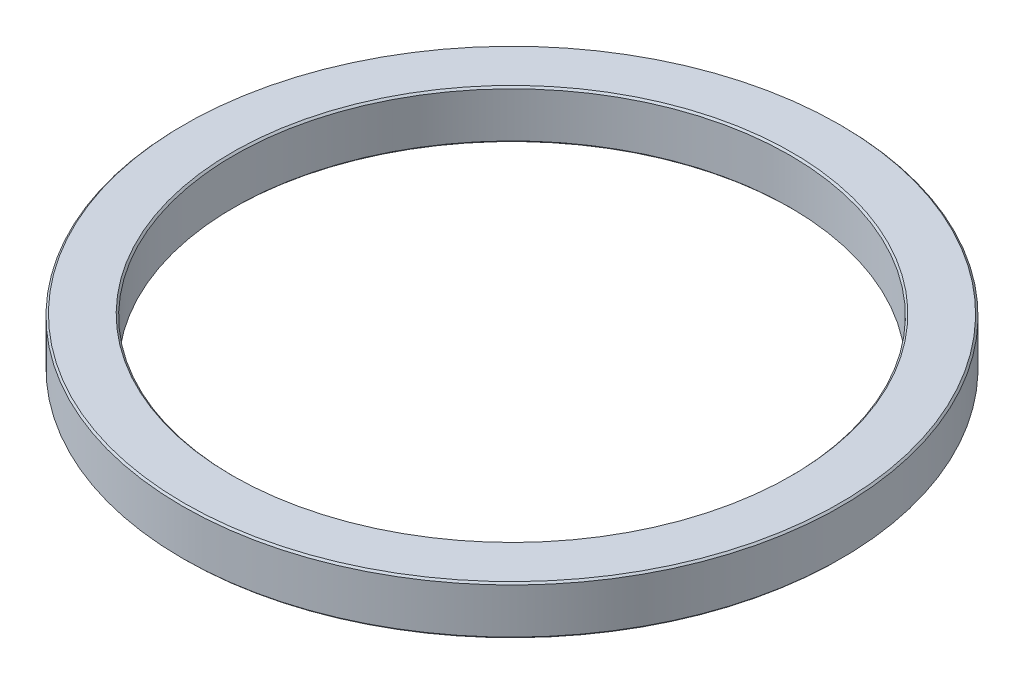
ISO-10303-21;
HEADER;
FILE_DESCRIPTION(('STEP AP214'),'2;1');
FILE_NAME('part.step','',(''),(''),'','','');
FILE_SCHEMA(('AUTOMOTIVE_DESIGN { 1 0 10303 214 1 1 1 1 }'));
ENDSEC;
DATA;
#1=APPLICATION_CONTEXT('core data for automotive mechanical design processes');
#2=APPLICATION_PROTOCOL_DEFINITION('international standard','automotive_design',2000,#1);
#3=PRODUCT_CONTEXT('',#1,'mechanical');
#4=PRODUCT('Part','Part','',(#3));
#5=PRODUCT_RELATED_PRODUCT_CATEGORY('part','',(#4));
#6=PRODUCT_DEFINITION_FORMATION('','',#4);
#7=PRODUCT_DEFINITION_CONTEXT('part definition',#1,'design');
#8=PRODUCT_DEFINITION('design','',#6,#7);
#9=PRODUCT_DEFINITION_SHAPE('','',#8);
#10=(LENGTH_UNIT() NAMED_UNIT(*) SI_UNIT(.MILLI.,.METRE.));
#11=(NAMED_UNIT(*) PLANE_ANGLE_UNIT() SI_UNIT($,.RADIAN.));
#12=(NAMED_UNIT(*) SI_UNIT($,.STERADIAN.) SOLID_ANGLE_UNIT());
#13=UNCERTAINTY_MEASURE_WITH_UNIT(LENGTH_MEASURE(1.E-05),#10,'distance_accuracy_value','');
#14=(GEOMETRIC_REPRESENTATION_CONTEXT(3) GLOBAL_UNCERTAINTY_ASSIGNED_CONTEXT((#13)) GLOBAL_UNIT_ASSIGNED_CONTEXT((#10,
#11,#12)) REPRESENTATION_CONTEXT('',''));
#15=CARTESIAN_POINT('',(0.,0.,0.));
#16=DIRECTION('',(0.,0.,1.));
#17=DIRECTION('',(1.,0.,0.));
#18=AXIS2_PLACEMENT_3D('',#15,#16,#17);
#19=CARTESIAN_POINT('',(0.,14.,0.));
#20=DIRECTION('',(0.,1.,0.));
#21=DIRECTION('',(0.,0.,1.));
#22=AXIS2_PLACEMENT_3D('',#19,#20,#21);
#23=PLANE('',#22);
#24=CARTESIAN_POINT('',(0.,14.,0.));
#25=DIRECTION('',(0.,1.,0.));
#26=DIRECTION('',(0.,0.,1.));
#27=AXIS2_PLACEMENT_3D('',#24,#25,#26);
#28=CIRCLE('',#27,94.4);
#29=CARTESIAN_POINT('',(0.,14.,94.4));
#30=VERTEX_POINT('',#29);
#31=EDGE_CURVE('E51',#30,#30,#28,.T.);
#32=ORIENTED_EDGE('',*,*,#31,.T.);
#33=EDGE_LOOP('',(#32));
#34=FACE_BOUND('',#33,.T.);
#35=CARTESIAN_POINT('',(0.,14.,0.));
#36=DIRECTION('',(0.,1.,0.));
#37=DIRECTION('',(0.,0.,1.));
#38=AXIS2_PLACEMENT_3D('',#35,#36,#37);
#39=CIRCLE('',#38,80.6);
#40=CARTESIAN_POINT('',(0.,14.,80.6));
#41=VERTEX_POINT('',#40);
#42=EDGE_CURVE('E55',#41,#41,#39,.F.);
#43=ORIENTED_EDGE('',*,*,#42,.T.);
#44=EDGE_LOOP('',(#43));
#45=FACE_BOUND('',#44,.T.);
#46=ADVANCED_FACE('F39',(#34,#45),#23,.T.);
#47=CARTESIAN_POINT('',(0.,0.,0.));
#48=DIRECTION('',(0.,1.,0.));
#49=DIRECTION('',(0.,0.,1.));
#50=AXIS2_PLACEMENT_3D('',#47,#48,#49);
#51=PLANE('',#50);
#52=CARTESIAN_POINT('',(0.,0.,0.));
#53=DIRECTION('',(0.,1.,0.));
#54=DIRECTION('',(0.,0.,1.));
#55=AXIS2_PLACEMENT_3D('',#52,#53,#54);
#56=CIRCLE('',#55,94.4);
#57=CARTESIAN_POINT('',(0.,0.,94.4));
#58=VERTEX_POINT('',#57);
#59=EDGE_CURVE('E60',#58,#58,#56,.F.);
#60=ORIENTED_EDGE('',*,*,#59,.T.);
#61=EDGE_LOOP('',(#60));
#62=FACE_BOUND('',#61,.T.);
#63=CARTESIAN_POINT('',(0.,0.,0.));
#64=DIRECTION('',(0.,1.,0.));
#65=DIRECTION('',(0.,0.,1.));
#66=AXIS2_PLACEMENT_3D('',#63,#64,#65);
#67=CIRCLE('',#66,80.6);
#68=CARTESIAN_POINT('',(0.,0.,80.6));
#69=VERTEX_POINT('',#68);
#70=EDGE_CURVE('E63',#69,#69,#67,.T.);
#71=ORIENTED_EDGE('',*,*,#70,.T.);
#72=EDGE_LOOP('',(#71));
#73=FACE_BOUND('',#72,.T.);
#74=ADVANCED_FACE('F85',(#62,#73),#51,.F.);
#75=CARTESIAN_POINT('',(0.,14.,0.));
#76=DIRECTION('',(0.,-1.,0.));
#77=DIRECTION('',(0.,0.,-1.));
#78=AXIS2_PLACEMENT_3D('',#75,#76,#77);
#79=CYLINDRICAL_SURFACE('',#78,94.9);
#80=CARTESIAN_POINT('',(0.,0.500000000000014,0.));
#81=DIRECTION('',(0.,1.,0.));
#82=DIRECTION('',(0.,0.,1.));
#83=AXIS2_PLACEMENT_3D('',#80,#81,#82);
#84=CIRCLE('',#83,94.9);
#85=CARTESIAN_POINT('',(0.,0.500000000000014,94.9));
#86=VERTEX_POINT('',#85);
#87=EDGE_CURVE('E66',#86,#86,#84,.T.);
#88=ORIENTED_EDGE('',*,*,#87,.T.);
#89=EDGE_LOOP('',(#88));
#90=FACE_BOUND('',#89,.T.);
#91=CARTESIAN_POINT('',(0.,13.5,0.));
#92=DIRECTION('',(0.,1.,0.));
#93=DIRECTION('',(0.,0.,1.));
#94=AXIS2_PLACEMENT_3D('',#91,#92,#93);
#95=CIRCLE('',#94,94.9);
#96=CARTESIAN_POINT('',(0.,13.5,94.9));
#97=VERTEX_POINT('',#96);
#98=EDGE_CURVE('E69',#97,#97,#95,.F.);
#99=ORIENTED_EDGE('',*,*,#98,.T.);
#100=EDGE_LOOP('',(#99));
#101=FACE_BOUND('',#100,.T.);
#102=ADVANCED_FACE('F73',(#90,#101),#79,.T.);
#103=CARTESIAN_POINT('',(0.,14.,0.));
#104=DIRECTION('',(0.,-1.,0.));
#105=DIRECTION('',(0.,0.,-1.));
#106=AXIS2_PLACEMENT_3D('',#103,#104,#105);
#107=CYLINDRICAL_SURFACE('',#106,80.1);
#108=CARTESIAN_POINT('',(0.,0.5,0.));
#109=DIRECTION('',(0.,1.,0.));
#110=DIRECTION('',(0.,0.,1.));
#111=AXIS2_PLACEMENT_3D('',#108,#109,#110);
#112=CIRCLE('',#111,80.1);
#113=CARTESIAN_POINT('',(0.,0.5,80.1));
#114=VERTEX_POINT('',#113);
#115=EDGE_CURVE('E10',#114,#114,#112,.F.);
#116=ORIENTED_EDGE('',*,*,#115,.T.);
#117=EDGE_LOOP('',(#116));
#118=FACE_BOUND('',#117,.T.);
#119=CARTESIAN_POINT('',(0.,13.5,0.));
#120=DIRECTION('',(0.,1.,0.));
#121=DIRECTION('',(0.,0.,1.));
#122=AXIS2_PLACEMENT_3D('',#119,#120,#121);
#123=CIRCLE('',#122,80.1);
#124=CARTESIAN_POINT('',(0.,13.5,80.1));
#125=VERTEX_POINT('',#124);
#126=EDGE_CURVE('E47',#125,#125,#123,.T.);
#127=ORIENTED_EDGE('',*,*,#126,.T.);
#128=EDGE_LOOP('',(#127));
#129=FACE_BOUND('',#128,.T.);
#130=ADVANCED_FACE('F110',(#118,#129),#107,.F.);
#131=CARTESIAN_POINT('',(0.,0.500000000000014,0.));
#132=DIRECTION('',(0.,1.,0.));
#133=DIRECTION('',(0.,0.,1.));
#134=AXIS2_PLACEMENT_3D('',#131,#132,#133);
#135=CONICAL_SURFACE('',#134,94.9,0.785398163397435);
#136=ORIENTED_EDGE('',*,*,#59,.F.);
#137=EDGE_LOOP('',(#136));
#138=FACE_BOUND('',#137,.T.);
#139=ORIENTED_EDGE('',*,*,#87,.F.);
#140=EDGE_LOOP('',(#139));
#141=FACE_BOUND('',#140,.T.);
#142=ADVANCED_FACE('F79',(#138,#141),#135,.T.);
#143=CARTESIAN_POINT('',(0.,14.,0.));
#144=DIRECTION('',(0.,-1.,0.));
#145=DIRECTION('',(0.,0.,-1.));
#146=AXIS2_PLACEMENT_3D('',#143,#144,#145);
#147=CONICAL_SURFACE('',#146,94.4,0.785398163397407);
#148=ORIENTED_EDGE('',*,*,#98,.F.);
#149=EDGE_LOOP('',(#148));
#150=FACE_BOUND('',#149,.T.);
#151=ORIENTED_EDGE('',*,*,#31,.F.);
#152=EDGE_LOOP('',(#151));
#153=FACE_BOUND('',#152,.T.);
#154=ADVANCED_FACE('F75',(#150,#153),#147,.T.);
#155=CARTESIAN_POINT('',(0.,0.,0.));
#156=DIRECTION('',(0.,-1.,0.));
#157=DIRECTION('',(0.,0.,-1.));
#158=AXIS2_PLACEMENT_3D('',#155,#156,#157);
#159=CONICAL_SURFACE('',#158,80.6,0.785398163397435);
#160=ORIENTED_EDGE('',*,*,#115,.F.);
#161=EDGE_LOOP('',(#160));
#162=FACE_BOUND('',#161,.T.);
#163=ORIENTED_EDGE('',*,*,#70,.F.);
#164=EDGE_LOOP('',(#163));
#165=FACE_BOUND('',#164,.T.);
#166=ADVANCED_FACE('F78',(#162,#165),#159,.F.);
#167=CARTESIAN_POINT('',(0.,13.5,0.));
#168=DIRECTION('',(0.,1.,0.));
#169=DIRECTION('',(0.,0.,1.));
#170=AXIS2_PLACEMENT_3D('',#167,#168,#169);
#171=CONICAL_SURFACE('',#170,80.1,0.785398163397448);
#172=ORIENTED_EDGE('',*,*,#42,.F.);
#173=EDGE_LOOP('',(#172));
#174=FACE_BOUND('',#173,.T.);
#175=ORIENTED_EDGE('',*,*,#126,.F.);
#176=EDGE_LOOP('',(#175));
#177=FACE_BOUND('',#176,.T.);
#178=ADVANCED_FACE('F42',(#174,#177),#171,.F.);
#179=CLOSED_SHELL('',(#46,#74,#102,#130,#142,#154,#166,#178));
#180=MANIFOLD_SOLID_BREP('B2',#179);
#181=ADVANCED_BREP_SHAPE_REPRESENTATION('',(#18,#180),#14);
#182=SHAPE_DEFINITION_REPRESENTATION(#9,#181);
ENDSEC;
END-ISO-10303-21;
